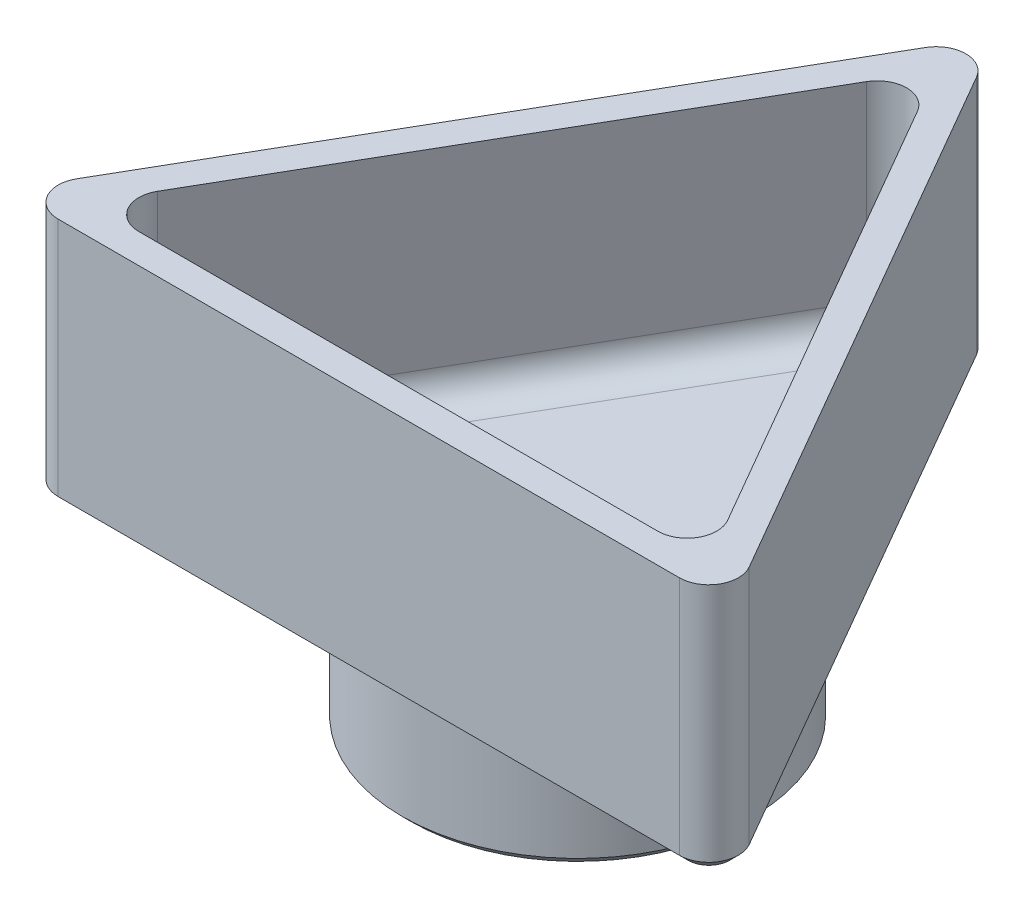
ISO-10303-21;
HEADER;
FILE_DESCRIPTION(('STEP AP214'),'2;1');
FILE_NAME('part.step','',(''),(''),'','','');
FILE_SCHEMA(('AUTOMOTIVE_DESIGN { 1 0 10303 214 1 1 1 1 }'));
ENDSEC;
DATA;
#1=APPLICATION_CONTEXT('core data for automotive mechanical design processes');
#2=APPLICATION_PROTOCOL_DEFINITION('international standard','automotive_design',2000,#1);
#3=PRODUCT_CONTEXT('',#1,'mechanical');
#4=PRODUCT('Part','Part','',(#3));
#5=PRODUCT_RELATED_PRODUCT_CATEGORY('part','',(#4));
#6=PRODUCT_DEFINITION_FORMATION('','',#4);
#7=PRODUCT_DEFINITION_CONTEXT('part definition',#1,'design');
#8=PRODUCT_DEFINITION('design','',#6,#7);
#9=PRODUCT_DEFINITION_SHAPE('','',#8);
#10=(LENGTH_UNIT() NAMED_UNIT(*) SI_UNIT(.MILLI.,.METRE.));
#11=(NAMED_UNIT(*) PLANE_ANGLE_UNIT() SI_UNIT($,.RADIAN.));
#12=(NAMED_UNIT(*) SI_UNIT($,.STERADIAN.) SOLID_ANGLE_UNIT());
#13=UNCERTAINTY_MEASURE_WITH_UNIT(LENGTH_MEASURE(1.E-05),#10,'distance_accuracy_value','');
#14=(GEOMETRIC_REPRESENTATION_CONTEXT(3) GLOBAL_UNCERTAINTY_ASSIGNED_CONTEXT((#13)) GLOBAL_UNIT_ASSIGNED_CONTEXT((#10,
#11,#12)) REPRESENTATION_CONTEXT('',''));
#15=CARTESIAN_POINT('',(0.,0.,0.));
#16=DIRECTION('',(0.,0.,1.));
#17=DIRECTION('',(1.,0.,0.));
#18=AXIS2_PLACEMENT_3D('',#15,#16,#17);
#19=CARTESIAN_POINT('',(0.,21.42998,0.));
#20=DIRECTION('',(0.,-1.,0.));
#21=DIRECTION('',(0.,0.,-1.));
#22=AXIS2_PLACEMENT_3D('',#19,#20,#21);
#23=PLANE('',#22);
#24=DIRECTION('',(-0.5,0.,-0.866025403784439));
#25=VECTOR('',#24,1.);
#26=CARTESIAN_POINT('',(0.,21.42998,-35.91687));
#27=LINE('',#26,#25);
#28=CARTESIAN_POINT('',(28.9052173188107,21.42998,14.148435));
#29=VERTEX_POINT('',#28);
#30=CARTESIAN_POINT('',(2.19970452561247,21.42998,-32.10687));
#31=VERTEX_POINT('',#30);
#32=EDGE_CURVE('E176',#29,#31,#27,.T.);
#33=ORIENTED_EDGE('',*,*,#32,.T.);
#34=CARTESIAN_POINT('',(0.,21.42998,-30.83687));
#35=DIRECTION('',(0.,-1.,0.));
#36=DIRECTION('',(0.,0.,-1.));
#37=AXIS2_PLACEMENT_3D('',#34,#35,#36);
#38=CIRCLE('',#37,2.54);
#39=CARTESIAN_POINT('',(-2.19970452561248,21.42998,-32.10687));
#40=VERTEX_POINT('',#39);
#41=EDGE_CURVE('E170',#31,#40,#38,.F.);
#42=ORIENTED_EDGE('',*,*,#41,.T.);
#43=DIRECTION('',(-0.5,0.,0.866025403784439));
#44=VECTOR('',#43,1.);
#45=CARTESIAN_POINT('',(-31.1049218444232,21.42998,17.958435));
#46=LINE('',#45,#44);
#47=CARTESIAN_POINT('',(-28.9052173188107,21.42998,14.148435));
#48=VERTEX_POINT('',#47);
#49=EDGE_CURVE('E173',#40,#48,#46,.T.);
#50=ORIENTED_EDGE('',*,*,#49,.T.);
#51=CARTESIAN_POINT('',(-26.7055127931982,21.42998,15.418435));
#52=DIRECTION('',(0.,-1.,0.));
#53=DIRECTION('',(0.,0.,-1.));
#54=AXIS2_PLACEMENT_3D('',#51,#52,#53);
#55=CIRCLE('',#54,2.54);
#56=CARTESIAN_POINT('',(-26.7055127931982,21.42998,17.958435));
#57=VERTEX_POINT('',#56);
#58=EDGE_CURVE('E204',#48,#57,#55,.F.);
#59=ORIENTED_EDGE('',*,*,#58,.T.);
#60=DIRECTION('',(1.,0.,0.));
#61=VECTOR('',#60,1.);
#62=CARTESIAN_POINT('',(31.1049218444232,21.42998,17.958435));
#63=LINE('',#62,#61);
#64=CARTESIAN_POINT('',(26.7055127931982,21.42998,17.958435));
#65=VERTEX_POINT('',#64);
#66=EDGE_CURVE('E189',#57,#65,#63,.T.);
#67=ORIENTED_EDGE('',*,*,#66,.T.);
#68=CARTESIAN_POINT('',(26.7055127931982,21.42998,15.418435));
#69=DIRECTION('',(0.,-1.,0.));
#70=DIRECTION('',(0.,0.,-1.));
#71=AXIS2_PLACEMENT_3D('',#68,#69,#70);
#72=CIRCLE('',#71,2.54);
#73=EDGE_CURVE('E180',#65,#29,#72,.F.);
#74=ORIENTED_EDGE('',*,*,#73,.T.);
#75=EDGE_LOOP('',(#33,#42,#50,#59,#67,#74));
#76=FACE_BOUND('',#75,.T.);
#77=DIRECTION('',(-0.5,0.,0.866025403784439));
#78=VECTOR('',#77,1.);
#79=CARTESIAN_POINT('',(-13.3527563965991,21.42998,-7.7092175));
#80=LINE('',#79,#78);
#81=CARTESIAN_POINT('',(-2.19970452561247,21.42998,-27.02687));
#82=VERTEX_POINT('',#81);
#83=CARTESIAN_POINT('',(-24.5058082675858,21.42998,11.608435));
#84=VERTEX_POINT('',#83);
#85=EDGE_CURVE('E270',#82,#84,#80,.T.);
#86=ORIENTED_EDGE('',*,*,#85,.F.);
#87=CARTESIAN_POINT('',(0.,21.42998,-25.75687));
#88=DIRECTION('',(0.,-1.,0.));
#89=DIRECTION('',(0.,0.,-1.));
#90=AXIS2_PLACEMENT_3D('',#87,#88,#89);
#91=CIRCLE('',#90,2.54);
#92=CARTESIAN_POINT('',(2.19970452561248,21.42998,-27.02687));
#93=VERTEX_POINT('',#92);
#94=EDGE_CURVE('E226',#82,#93,#91,.T.);
#95=ORIENTED_EDGE('',*,*,#94,.T.);
#96=DIRECTION('',(-0.5,0.,-0.866025403784439));
#97=VECTOR('',#96,1.);
#98=CARTESIAN_POINT('',(13.3527563965991,21.42998,-7.7092175));
#99=LINE('',#98,#97);
#100=CARTESIAN_POINT('',(24.5058082675858,21.42998,11.608435));
#101=VERTEX_POINT('',#100);
#102=EDGE_CURVE('E190',#101,#93,#99,.T.);
#103=ORIENTED_EDGE('',*,*,#102,.F.);
#104=CARTESIAN_POINT('',(22.3061037419733,21.42998,12.878435));
#105=DIRECTION('',(0.,-1.,0.));
#106=DIRECTION('',(0.,0.,-1.));
#107=AXIS2_PLACEMENT_3D('',#104,#105,#106);
#108=CIRCLE('',#107,2.54);
#109=CARTESIAN_POINT('',(22.3061037419733,21.42998,15.418435));
#110=VERTEX_POINT('',#109);
#111=EDGE_CURVE('E228',#101,#110,#108,.T.);
#112=ORIENTED_EDGE('',*,*,#111,.T.);
#113=DIRECTION('',(1.,0.,0.));
#114=VECTOR('',#113,1.);
#115=CARTESIAN_POINT('',(0.,21.42998,15.418435));
#116=LINE('',#115,#114);
#117=CARTESIAN_POINT('',(-22.3061037419733,21.42998,15.418435));
#118=VERTEX_POINT('',#117);
#119=EDGE_CURVE('E461',#118,#110,#116,.T.);
#120=ORIENTED_EDGE('',*,*,#119,.F.);
#121=CARTESIAN_POINT('',(-22.3061037419733,21.42998,12.878435));
#122=DIRECTION('',(0.,-1.,0.));
#123=DIRECTION('',(0.,0.,-1.));
#124=AXIS2_PLACEMENT_3D('',#121,#122,#123);
#125=CIRCLE('',#124,2.54);
#126=EDGE_CURVE('E230',#118,#84,#125,.T.);
#127=ORIENTED_EDGE('',*,*,#126,.T.);
#128=EDGE_LOOP('',(#86,#95,#103,#112,#120,#127));
#129=FACE_BOUND('',#128,.T.);
#130=ADVANCED_FACE('F50',(#76,#129),#23,.F.);
#131=CARTESIAN_POINT('',(-31.1049218444232,21.42998,17.958435));
#132=DIRECTION('',(0.866025403784438,0.,0.5));
#133=DIRECTION('',(0.5,0.,-0.866025403784439));
#134=AXIS2_PLACEMENT_3D('',#131,#132,#133);
#135=PLANE('',#134);
#136=DIRECTION('',(0.,-1.,0.));
#137=VECTOR('',#136,1.);
#138=CARTESIAN_POINT('',(-2.19970452561247,21.42998,-32.10687));
#139=LINE('',#138,#137);
#140=CARTESIAN_POINT('',(-2.19970452561247,0.761999999999999,-32.10687));
#141=VERTEX_POINT('',#140);
#142=EDGE_CURVE('E185',#40,#141,#139,.T.);
#143=ORIENTED_EDGE('',*,*,#142,.T.);
#144=DIRECTION('',(-0.5,0.,0.866025403784439));
#145=VECTOR('',#144,1.);
#146=CARTESIAN_POINT('',(-28.9052173188107,0.761999999999999,14.148435));
#147=LINE('',#146,#145);
#148=CARTESIAN_POINT('',(-28.9052173188107,0.761999999999999,14.148435));
#149=VERTEX_POINT('',#148);
#150=EDGE_CURVE('E288',#141,#149,#147,.T.);
#151=ORIENTED_EDGE('',*,*,#150,.T.);
#152=DIRECTION('',(0.,-1.,0.));
#153=VECTOR('',#152,1.);
#154=CARTESIAN_POINT('',(-28.9052173188107,21.42998,14.148435));
#155=LINE('',#154,#153);
#156=EDGE_CURVE('E188',#149,#48,#155,.F.);
#157=ORIENTED_EDGE('',*,*,#156,.T.);
#158=ORIENTED_EDGE('',*,*,#49,.F.);
#159=EDGE_LOOP('',(#143,#151,#157,#158));
#160=FACE_BOUND('',#159,.T.);
#161=ADVANCED_FACE('F184',(#160),#135,.F.);
#162=CARTESIAN_POINT('',(31.1049218444232,21.42998,17.958435));
#163=DIRECTION('',(0.,0.,-1.));
#164=DIRECTION('',(-1.,0.,0.));
#165=AXIS2_PLACEMENT_3D('',#162,#163,#164);
#166=PLANE('',#165);
#167=DIRECTION('',(0.,-1.,0.));
#168=VECTOR('',#167,1.);
#169=CARTESIAN_POINT('',(-26.7055127931982,21.42998,17.958435));
#170=LINE('',#169,#168);
#171=CARTESIAN_POINT('',(-26.7055127931982,0.761999999999999,17.958435));
#172=VERTEX_POINT('',#171);
#173=EDGE_CURVE('E179',#57,#172,#170,.T.);
#174=ORIENTED_EDGE('',*,*,#173,.T.);
#175=DIRECTION('',(1.,0.,0.));
#176=VECTOR('',#175,1.);
#177=CARTESIAN_POINT('',(26.7055127931982,0.761999999999999,17.958435));
#178=LINE('',#177,#176);
#179=CARTESIAN_POINT('',(26.7055127931982,0.761999999999999,17.958435));
#180=VERTEX_POINT('',#179);
#181=EDGE_CURVE('E286',#172,#180,#178,.T.);
#182=ORIENTED_EDGE('',*,*,#181,.T.);
#183=DIRECTION('',(0.,-1.,0.));
#184=VECTOR('',#183,1.);
#185=CARTESIAN_POINT('',(26.7055127931982,21.42998,17.958435));
#186=LINE('',#185,#184);
#187=EDGE_CURVE('E209',#180,#65,#186,.F.);
#188=ORIENTED_EDGE('',*,*,#187,.T.);
#189=ORIENTED_EDGE('',*,*,#66,.F.);
#190=EDGE_LOOP('',(#174,#182,#188,#189));
#191=FACE_BOUND('',#190,.T.);
#192=ADVANCED_FACE('F329',(#191),#166,.F.);
#193=CARTESIAN_POINT('',(0.,21.42998,-35.91687));
#194=DIRECTION('',(-0.866025403784438,0.,0.5));
#195=DIRECTION('',(0.5,0.,0.866025403784439));
#196=AXIS2_PLACEMENT_3D('',#193,#194,#195);
#197=PLANE('',#196);
#198=DIRECTION('',(0.,-1.,0.));
#199=VECTOR('',#198,1.);
#200=CARTESIAN_POINT('',(28.9052173188107,21.42998,14.148435));
#201=LINE('',#200,#199);
#202=CARTESIAN_POINT('',(28.9052173188107,0.761999999999999,14.148435));
#203=VERTEX_POINT('',#202);
#204=EDGE_CURVE('E195',#29,#203,#201,.T.);
#205=ORIENTED_EDGE('',*,*,#204,.T.);
#206=DIRECTION('',(-0.5,0.,-0.866025403784439));
#207=VECTOR('',#206,1.);
#208=CARTESIAN_POINT('',(2.19970452561247,0.761999999999999,-32.10687));
#209=LINE('',#208,#207);
#210=CARTESIAN_POINT('',(2.19970452561247,0.761999999999999,-32.10687));
#211=VERTEX_POINT('',#210);
#212=EDGE_CURVE('E66',#203,#211,#209,.T.);
#213=ORIENTED_EDGE('',*,*,#212,.T.);
#214=DIRECTION('',(0.,-1.,0.));
#215=VECTOR('',#214,1.);
#216=CARTESIAN_POINT('',(2.19970452561247,21.42998,-32.10687));
#217=LINE('',#216,#215);
#218=EDGE_CURVE('E197',#211,#31,#217,.F.);
#219=ORIENTED_EDGE('',*,*,#218,.T.);
#220=ORIENTED_EDGE('',*,*,#32,.F.);
#221=EDGE_LOOP('',(#205,#213,#219,#220));
#222=FACE_BOUND('',#221,.T.);
#223=ADVANCED_FACE('F339',(#222),#197,.F.);
#224=CARTESIAN_POINT('',(0.,0.,0.));
#225=DIRECTION('',(0.,-1.,0.));
#226=DIRECTION('',(0.,0.,-1.));
#227=AXIS2_PLACEMENT_3D('',#224,#225,#226);
#228=PLANE('',#227);
#229=DIRECTION('',(-1.,0.,0.));
#230=VECTOR('',#229,1.);
#231=CARTESIAN_POINT('',(-26.7055127931982,0.,17.196435));
#232=LINE('',#231,#230);
#233=CARTESIAN_POINT('',(26.7055127931982,0.,17.196435));
#234=VERTEX_POINT('',#233);
#235=CARTESIAN_POINT('',(-26.7055127931982,0.,17.196435));
#236=VERTEX_POINT('',#235);
#237=EDGE_CURVE('E278',#234,#236,#232,.T.);
#238=ORIENTED_EDGE('',*,*,#237,.T.);
#239=CARTESIAN_POINT('',(-26.7055127931982,0.,15.418435));
#240=DIRECTION('',(0.,-1.,0.));
#241=DIRECTION('',(0.,0.,-1.));
#242=AXIS2_PLACEMENT_3D('',#239,#240,#241);
#243=CIRCLE('',#242,1.778);
#244=CARTESIAN_POINT('',(-28.245305961127,0.,14.529435));
#245=VERTEX_POINT('',#244);
#246=EDGE_CURVE('E280',#236,#245,#243,.T.);
#247=ORIENTED_EDGE('',*,*,#246,.T.);
#248=DIRECTION('',(0.5,0.,-0.866025403784439));
#249=VECTOR('',#248,1.);
#250=CARTESIAN_POINT('',(-1.53979316792873,0.,-31.72587));
#251=LINE('',#250,#249);
#252=CARTESIAN_POINT('',(-1.53979316792873,0.,-31.72587));
#253=VERTEX_POINT('',#252);
#254=EDGE_CURVE('E276',#245,#253,#251,.T.);
#255=ORIENTED_EDGE('',*,*,#254,.T.);
#256=CARTESIAN_POINT('',(0.,0.,-30.83687));
#257=DIRECTION('',(0.,-1.,0.));
#258=DIRECTION('',(0.,0.,-1.));
#259=AXIS2_PLACEMENT_3D('',#256,#257,#258);
#260=CIRCLE('',#259,1.778);
#261=CARTESIAN_POINT('',(1.53979316792874,0.,-31.72587));
#262=VERTEX_POINT('',#261);
#263=EDGE_CURVE('E272',#253,#262,#260,.T.);
#264=ORIENTED_EDGE('',*,*,#263,.T.);
#265=DIRECTION('',(0.5,0.,0.866025403784439));
#266=VECTOR('',#265,1.);
#267=CARTESIAN_POINT('',(28.245305961127,0.,14.529435));
#268=LINE('',#267,#266);
#269=CARTESIAN_POINT('',(28.245305961127,0.,14.529435));
#270=VERTEX_POINT('',#269);
#271=EDGE_CURVE('E252',#262,#270,#268,.T.);
#272=ORIENTED_EDGE('',*,*,#271,.T.);
#273=CARTESIAN_POINT('',(26.7055127931982,0.,15.418435));
#274=DIRECTION('',(0.,-1.,0.));
#275=DIRECTION('',(0.,0.,-1.));
#276=AXIS2_PLACEMENT_3D('',#273,#274,#275);
#277=CIRCLE('',#276,1.778);
#278=EDGE_CURVE('E274',#270,#234,#277,.T.);
#279=ORIENTED_EDGE('',*,*,#278,.T.);
#280=EDGE_LOOP('',(#238,#247,#255,#264,#272,#279));
#281=FACE_BOUND('',#280,.T.);
#282=CARTESIAN_POINT('',(0.,0.,0.));
#283=DIRECTION('',(0.,-1.,0.));
#284=DIRECTION('',(0.,0.,-1.));
#285=AXIS2_PLACEMENT_3D('',#282,#283,#284);
#286=CIRCLE('',#285,15.08125);
#287=CARTESIAN_POINT('',(0.,0.,15.08125));
#288=VERTEX_POINT('',#287);
#289=EDGE_CURVE('E199',#288,#288,#286,.T.);
#290=ORIENTED_EDGE('',*,*,#289,.F.);
#291=EDGE_LOOP('',(#290));
#292=FACE_BOUND('',#291,.T.);
#293=ADVANCED_FACE('F335',(#281,#292),#228,.T.);
#294=CARTESIAN_POINT('',(-28.9052173188107,21.42998,19.228435));
#295=DIRECTION('',(0.866025403784438,0.,0.5));
#296=DIRECTION('',(0.5,0.,-0.866025403784439));
#297=AXIS2_PLACEMENT_3D('',#294,#295,#296);
#298=PLANE('',#297);
#299=DIRECTION('',(0.,-1.,0.));
#300=VECTOR('',#299,1.);
#301=CARTESIAN_POINT('',(-24.5058082675858,2.54,11.608435));
#302=LINE('',#301,#300);
#303=CARTESIAN_POINT('',(-24.5058082675858,5.08,11.608435));
#304=VERTEX_POINT('',#303);
#305=EDGE_CURVE('E216',#84,#304,#302,.T.);
#306=ORIENTED_EDGE('',*,*,#305,.T.);
#307=DIRECTION('',(-0.5,0.,0.866025403784439));
#308=VECTOR('',#307,1.);
#309=CARTESIAN_POINT('',(-28.9052173188107,5.08,19.228435));
#310=LINE('',#309,#308);
#311=CARTESIAN_POINT('',(-2.19970452561247,5.08,-27.02687));
#312=VERTEX_POINT('',#311);
#313=EDGE_CURVE('E246',#304,#312,#310,.F.);
#314=ORIENTED_EDGE('',*,*,#313,.T.);
#315=DIRECTION('',(0.,-1.,0.));
#316=VECTOR('',#315,1.);
#317=CARTESIAN_POINT('',(-2.19970452561247,21.42998,-27.02687));
#318=LINE('',#317,#316);
#319=EDGE_CURVE('E219',#312,#82,#318,.F.);
#320=ORIENTED_EDGE('',*,*,#319,.T.);
#321=ORIENTED_EDGE('',*,*,#85,.T.);
#322=EDGE_LOOP('',(#306,#314,#320,#321));
#323=FACE_BOUND('',#322,.T.);
#324=ADVANCED_FACE('F338',(#323),#298,.T.);
#325=CARTESIAN_POINT('',(31.1049218444232,21.42998,15.418435));
#326=DIRECTION('',(0.,0.,-1.));
#327=DIRECTION('',(-1.,0.,0.));
#328=AXIS2_PLACEMENT_3D('',#325,#326,#327);
#329=PLANE('',#328);
#330=DIRECTION('',(0.,-1.,0.));
#331=VECTOR('',#330,1.);
#332=CARTESIAN_POINT('',(22.3061037419733,2.54,15.418435));
#333=LINE('',#332,#331);
#334=CARTESIAN_POINT('',(22.3061037419733,5.08,15.418435));
#335=VERTEX_POINT('',#334);
#336=EDGE_CURVE('E223',#110,#335,#333,.T.);
#337=ORIENTED_EDGE('',*,*,#336,.T.);
#338=DIRECTION('',(1.,0.,0.));
#339=VECTOR('',#338,1.);
#340=CARTESIAN_POINT('',(31.1049218444232,5.08,15.418435));
#341=LINE('',#340,#339);
#342=CARTESIAN_POINT('',(-22.3061037419733,5.08,15.418435));
#343=VERTEX_POINT('',#342);
#344=EDGE_CURVE('E242',#335,#343,#341,.F.);
#345=ORIENTED_EDGE('',*,*,#344,.T.);
#346=DIRECTION('',(0.,-1.,0.));
#347=VECTOR('',#346,1.);
#348=CARTESIAN_POINT('',(-22.3061037419733,21.42998,15.418435));
#349=LINE('',#348,#347);
#350=EDGE_CURVE('E221',#343,#118,#349,.F.);
#351=ORIENTED_EDGE('',*,*,#350,.T.);
#352=ORIENTED_EDGE('',*,*,#119,.T.);
#353=EDGE_LOOP('',(#337,#345,#351,#352));
#354=FACE_BOUND('',#353,.T.);
#355=ADVANCED_FACE('F488',(#354),#329,.T.);
#356=CARTESIAN_POINT('',(-2.19970452561247,21.42998,-34.64687));
#357=DIRECTION('',(-0.866025403784438,0.,0.5));
#358=DIRECTION('',(0.5,0.,0.866025403784439));
#359=AXIS2_PLACEMENT_3D('',#356,#357,#358);
#360=PLANE('',#359);
#361=DIRECTION('',(0.,-1.,0.));
#362=VECTOR('',#361,1.);
#363=CARTESIAN_POINT('',(2.19970452561248,2.54,-27.02687));
#364=LINE('',#363,#362);
#365=CARTESIAN_POINT('',(2.19970452561248,5.08,-27.02687));
#366=VERTEX_POINT('',#365);
#367=EDGE_CURVE('E213',#93,#366,#364,.T.);
#368=ORIENTED_EDGE('',*,*,#367,.T.);
#369=DIRECTION('',(-0.5,0.,-0.866025403784439));
#370=VECTOR('',#369,1.);
#371=CARTESIAN_POINT('',(-2.19970452561247,5.08,-34.64687));
#372=LINE('',#371,#370);
#373=CARTESIAN_POINT('',(24.5058082675858,5.08,11.608435));
#374=VERTEX_POINT('',#373);
#375=EDGE_CURVE('E250',#366,#374,#372,.F.);
#376=ORIENTED_EDGE('',*,*,#375,.T.);
#377=DIRECTION('',(0.,-1.,0.));
#378=VECTOR('',#377,1.);
#379=CARTESIAN_POINT('',(24.5058082675858,21.42998,11.608435));
#380=LINE('',#379,#378);
#381=EDGE_CURVE('E211',#374,#101,#380,.F.);
#382=ORIENTED_EDGE('',*,*,#381,.T.);
#383=ORIENTED_EDGE('',*,*,#102,.T.);
#384=EDGE_LOOP('',(#368,#376,#382,#383));
#385=FACE_BOUND('',#384,.T.);
#386=ADVANCED_FACE('F469',(#385),#360,.T.);
#387=CARTESIAN_POINT('',(0.,2.54,0.));
#388=DIRECTION('',(0.,-1.,0.));
#389=DIRECTION('',(0.,0.,-1.));
#390=AXIS2_PLACEMENT_3D('',#387,#388,#389);
#391=PLANE('',#390);
#392=DIRECTION('',(-0.5,0.,0.866025403784439));
#393=VECTOR('',#392,1.);
#394=CARTESIAN_POINT('',(-11.1530518709866,2.54,-6.4392175));
#395=LINE('',#394,#393);
#396=CARTESIAN_POINT('',(0.,2.54,-25.75687));
#397=VERTEX_POINT('',#396);
#398=CARTESIAN_POINT('',(-22.3061037419733,2.54,12.878435));
#399=VERTEX_POINT('',#398);
#400=EDGE_CURVE('E237',#397,#399,#395,.T.);
#401=ORIENTED_EDGE('',*,*,#400,.T.);
#402=DIRECTION('',(1.,0.,0.));
#403=VECTOR('',#402,1.);
#404=CARTESIAN_POINT('',(0.,2.54,12.878435));
#405=LINE('',#404,#403);
#406=CARTESIAN_POINT('',(22.3061037419733,2.54,12.878435));
#407=VERTEX_POINT('',#406);
#408=EDGE_CURVE('E239',#399,#407,#405,.T.);
#409=ORIENTED_EDGE('',*,*,#408,.T.);
#410=DIRECTION('',(-0.5,0.,-0.866025403784439));
#411=VECTOR('',#410,1.);
#412=CARTESIAN_POINT('',(11.1530518709866,2.54,-6.4392175));
#413=LINE('',#412,#411);
#414=EDGE_CURVE('E235',#407,#397,#413,.T.);
#415=ORIENTED_EDGE('',*,*,#414,.T.);
#416=EDGE_LOOP('',(#401,#409,#415));
#417=FACE_BOUND('',#416,.T.);
#418=ADVANCED_FACE('F333',(#417),#391,.F.);
#419=CARTESIAN_POINT('',(0.,-11.90498,0.));
#420=DIRECTION('',(0.,1.,0.));
#421=DIRECTION('',(0.,0.,1.));
#422=AXIS2_PLACEMENT_3D('',#419,#420,#421);
#423=CYLINDRICAL_SURFACE('',#422,15.08125);
#424=CARTESIAN_POINT('',(0.,-11.14298,0.));
#425=DIRECTION('',(0.,-1.,0.));
#426=DIRECTION('',(0.,0.,-1.));
#427=AXIS2_PLACEMENT_3D('',#424,#425,#426);
#428=CIRCLE('',#427,15.08125);
#429=CARTESIAN_POINT('',(0.,-11.14298,15.08125));
#430=VERTEX_POINT('',#429);
#431=EDGE_CURVE('E13',#430,#430,#428,.F.);
#432=CARTESIAN_POINT('',(0.,-11.14298,15.08125));
#433=CARTESIAN_POINT('',(0.,-11.0269072916667,15.08125));
#434=CARTESIAN_POINT('',(0.,-10.9108345833334,15.08125));
#435=CARTESIAN_POINT('',(0.,-10.6786891666667,15.08125));
#436=CARTESIAN_POINT('',(0.,-10.5626164583334,15.08125));
#437=CARTESIAN_POINT('',(0.,-10.3304710416667,15.08125));
#438=CARTESIAN_POINT('',(0.,-10.2143983333334,15.08125));
#439=CARTESIAN_POINT('',(0.,-9.98225291666669,15.08125));
#440=CARTESIAN_POINT('',(0.,-9.86618020833335,15.08125));
#441=CARTESIAN_POINT('',(0.,-9.63403479166669,15.08125));
#442=CARTESIAN_POINT('',(0.,-9.51796208333335,15.08125));
#443=CARTESIAN_POINT('',(0.,-9.28581666666669,15.08125));
#444=CARTESIAN_POINT('',(0.,-9.16974395833335,15.08125));
#445=CARTESIAN_POINT('',(0.,-8.93759854166669,15.08125));
#446=CARTESIAN_POINT('',(0.,-8.82152583333335,15.08125));
#447=CARTESIAN_POINT('',(0.,-8.58938041666669,15.08125));
#448=CARTESIAN_POINT('',(0.,-8.47330770833335,15.08125));
#449=CARTESIAN_POINT('',(0.,-8.24116229166668,15.08125));
#450=CARTESIAN_POINT('',(0.,-8.12508958333335,15.08125));
#451=CARTESIAN_POINT('',(0.,-7.89294416666668,15.08125));
#452=CARTESIAN_POINT('',(0.,-7.77687145833335,15.08125));
#453=CARTESIAN_POINT('',(0.,-7.54472604166668,15.08125));
#454=CARTESIAN_POINT('',(0.,-7.42865333333335,15.08125));
#455=CARTESIAN_POINT('',(0.,-7.19650791666668,15.08125));
#456=CARTESIAN_POINT('',(0.,-7.08043520833335,15.08125));
#457=CARTESIAN_POINT('',(0.,-6.84828979166668,15.08125));
#458=CARTESIAN_POINT('',(0.,-6.73221708333335,15.08125));
#459=CARTESIAN_POINT('',(0.,-6.50007166666668,15.08125));
#460=CARTESIAN_POINT('',(0.,-6.38399895833335,15.08125));
#461=CARTESIAN_POINT('',(0.,-6.15185354166668,15.08125));
#462=CARTESIAN_POINT('',(0.,-6.03578083333335,15.08125));
#463=CARTESIAN_POINT('',(0.,-5.80363541666668,15.08125));
#464=CARTESIAN_POINT('',(0.,-5.68756270833335,15.08125));
#465=CARTESIAN_POINT('',(0.,-5.45541729166668,15.08125));
#466=CARTESIAN_POINT('',(0.,-5.33934458333335,15.08125));
#467=CARTESIAN_POINT('',(0.,-5.10719916666668,15.08125));
#468=CARTESIAN_POINT('',(0.,-4.99112645833335,15.08125));
#469=CARTESIAN_POINT('',(0.,-4.75898104166668,15.08125));
#470=CARTESIAN_POINT('',(0.,-4.64290833333334,15.08125));
#471=CARTESIAN_POINT('',(0.,-4.41076291666668,15.08125));
#472=CARTESIAN_POINT('',(0.,-4.29469020833334,15.08125));
#473=CARTESIAN_POINT('',(0.,-4.06254479166668,15.08125));
#474=CARTESIAN_POINT('',(0.,-3.94647208333334,15.08125));
#475=CARTESIAN_POINT('',(0.,-3.71432666666667,15.08125));
#476=CARTESIAN_POINT('',(0.,-3.59825395833334,15.08125));
#477=CARTESIAN_POINT('',(0.,-3.36610854166667,15.08125));
#478=CARTESIAN_POINT('',(0.,-3.25003583333334,15.08125));
#479=CARTESIAN_POINT('',(0.,-3.01789041666667,15.08125));
#480=CARTESIAN_POINT('',(0.,-2.90181770833334,15.08125));
#481=CARTESIAN_POINT('',(0.,-2.66967229166667,15.08125));
#482=CARTESIAN_POINT('',(0.,-2.55359958333334,15.08125));
#483=CARTESIAN_POINT('',(0.,-2.32145416666667,15.08125));
#484=CARTESIAN_POINT('',(0.,-2.20538145833334,15.08125));
#485=CARTESIAN_POINT('',(0.,-1.97323604166667,15.08125));
#486=CARTESIAN_POINT('',(0.,-1.85716333333334,15.08125));
#487=CARTESIAN_POINT('',(0.,-1.62501791666667,15.08125));
#488=CARTESIAN_POINT('',(0.,-1.50894520833334,15.08125));
#489=CARTESIAN_POINT('',(0.,-1.27679979166667,15.08125));
#490=CARTESIAN_POINT('',(0.,-1.16072708333333,15.08125));
#491=CARTESIAN_POINT('',(0.,-0.928581666666667,15.08125));
#492=CARTESIAN_POINT('',(0.,-0.812508958333333,15.08125));
#493=CARTESIAN_POINT('',(0.,-0.580363541666666,15.08125));
#494=CARTESIAN_POINT('',(0.,-0.464290833333333,15.08125));
#495=CARTESIAN_POINT('',(0.,-0.232145416666665,15.08125));
#496=CARTESIAN_POINT('',(0.,-0.116072708333332,15.08125));
#497=CARTESIAN_POINT('',(0.,0.,15.08125));
#498=B_SPLINE_CURVE_WITH_KNOTS('',3,(#432,#433,#434,#435,#436,#437,#438,#439,#440,#441,#442,
#443,#444,#445,#446,#447,#448,#449,#450,#451,#452,#453,#454,#455,#456,#457,#458,#459,#460,#461,
#462,#463,#464,#465,#466,#467,#468,#469,#470,#471,#472,#473,#474,#475,#476,#477,#478,#479,#480,
#481,#482,#483,#484,#485,#486,#487,#488,#489,#490,#491,#492,#493,#494,#495,#496,#497),
.UNSPECIFIED.,.F.,.F.,(4,2,2,2,2,2,2,2,2,2,2,2,2,2,2,2,2,2,2,2,2,2,2,2,2,2,2,2,2,2,2,2,4),(0.,
0.348218125000001,0.696436250000003,1.044654375,1.3928725,1.74109062500001,2.08930875000001,
2.43752687500001,2.78574500000001,3.13396312500001,3.48218125000001,3.83039937500001,
4.17861750000001,4.52683562500001,4.87505375000001,5.22327187500001,5.57149000000001,
5.91970812500001,6.26792625000002,6.61614437500002,6.96436250000002,7.31258062500002,
7.66079875000002,8.00901687500002,8.35723500000002,8.70545312500002,9.05367125000002,
9.40188937500002,9.75010750000003,10.098325625,10.44654375,10.794761875,11.14298),.UNSPECIFIED.);
#499=EDGE_CURVE('BSEAM505',#430,#288,#498,.T.);
#500=ORIENTED_EDGE('',*,*,#431,.T.);
#501=ORIENTED_EDGE('',*,*,#289,.T.);
#502=ORIENTED_EDGE('',*,*,#499,.T.);
#503=ORIENTED_EDGE('',*,*,#499,.F.);
#504=EDGE_LOOP('',(#500,#502,#501,#503));
#505=FACE_BOUND('',#504,.T.);
#506=ADVANCED_FACE('F505',(#505),#423,.T.);
#507=CARTESIAN_POINT('',(0.,-11.90498,0.));
#508=DIRECTION('',(0.,-1.,0.));
#509=DIRECTION('',(0.,0.,-1.));
#510=AXIS2_PLACEMENT_3D('',#507,#508,#509);
#511=PLANE('',#510);
#512=CARTESIAN_POINT('',(0.,-11.90498,0.));
#513=DIRECTION('',(0.,-1.,0.));
#514=DIRECTION('',(0.,0.,-1.));
#515=AXIS2_PLACEMENT_3D('',#512,#513,#514);
#516=CIRCLE('',#515,14.31925);
#517=CARTESIAN_POINT('',(0.,-11.90498,-14.31925));
#518=VERTEX_POINT('',#517);
#519=EDGE_CURVE('E59',#518,#518,#516,.T.);
#520=ORIENTED_EDGE('',*,*,#519,.T.);
#521=EDGE_LOOP('',(#520));
#522=FACE_BOUND('',#521,.T.);
#523=CARTESIAN_POINT('',(0.,-11.90498,0.));
#524=DIRECTION('',(0.,-1.,0.));
#525=DIRECTION('',(0.,0.,-1.));
#526=AXIS2_PLACEMENT_3D('',#523,#524,#525);
#527=CIRCLE('',#526,12.54125);
#528=CARTESIAN_POINT('',(0.,-11.90498,-12.54125));
#529=VERTEX_POINT('',#528);
#530=EDGE_CURVE('E531',#529,#529,#527,.T.);
#531=ORIENTED_EDGE('',*,*,#530,.F.);
#532=EDGE_LOOP('',(#531));
#533=FACE_BOUND('',#532,.T.);
#534=ADVANCED_FACE('F311',(#522,#533),#511,.T.);
#535=CARTESIAN_POINT('',(0.,21.42998,-30.83687));
#536=DIRECTION('',(0.,-1.,0.));
#537=DIRECTION('',(0.,0.,-1.));
#538=AXIS2_PLACEMENT_3D('',#535,#536,#537);
#539=CYLINDRICAL_SURFACE('',#538,2.54);
#540=ORIENTED_EDGE('',*,*,#218,.F.);
#541=CARTESIAN_POINT('',(0.,0.761999999999999,-30.83687));
#542=DIRECTION('',(0.,-1.,0.));
#543=DIRECTION('',(0.,0.,-1.));
#544=AXIS2_PLACEMENT_3D('',#541,#542,#543);
#545=CIRCLE('',#544,2.54);
#546=EDGE_CURVE('E194',#211,#141,#545,.F.);
#547=ORIENTED_EDGE('',*,*,#546,.T.);
#548=ORIENTED_EDGE('',*,*,#142,.F.);
#549=ORIENTED_EDGE('',*,*,#41,.F.);
#550=EDGE_LOOP('',(#540,#547,#548,#549));
#551=FACE_BOUND('',#550,.T.);
#552=ADVANCED_FACE('F192',(#551),#539,.T.);
#553=CARTESIAN_POINT('',(26.7055127931982,21.42998,15.418435));
#554=DIRECTION('',(0.,-1.,0.));
#555=DIRECTION('',(0.,0.,-1.));
#556=AXIS2_PLACEMENT_3D('',#553,#554,#555);
#557=CYLINDRICAL_SURFACE('',#556,2.54);
#558=ORIENTED_EDGE('',*,*,#187,.F.);
#559=CARTESIAN_POINT('',(26.7055127931982,0.761999999999999,15.418435));
#560=DIRECTION('',(0.,-1.,0.));
#561=DIRECTION('',(0.,0.,-1.));
#562=AXIS2_PLACEMENT_3D('',#559,#560,#561);
#563=CIRCLE('',#562,2.54);
#564=EDGE_CURVE('E74',#180,#203,#563,.F.);
#565=ORIENTED_EDGE('',*,*,#564,.T.);
#566=ORIENTED_EDGE('',*,*,#204,.F.);
#567=ORIENTED_EDGE('',*,*,#73,.F.);
#568=EDGE_LOOP('',(#558,#565,#566,#567));
#569=FACE_BOUND('',#568,.T.);
#570=ADVANCED_FACE('F348',(#569),#557,.T.);
#571=CARTESIAN_POINT('',(-26.7055127931982,21.42998,15.418435));
#572=DIRECTION('',(0.,-1.,0.));
#573=DIRECTION('',(0.,0.,-1.));
#574=AXIS2_PLACEMENT_3D('',#571,#572,#573);
#575=CYLINDRICAL_SURFACE('',#574,2.54);
#576=ORIENTED_EDGE('',*,*,#156,.F.);
#577=CARTESIAN_POINT('',(-26.7055127931982,0.761999999999999,15.418435));
#578=DIRECTION('',(0.,-1.,0.));
#579=DIRECTION('',(0.,0.,-1.));
#580=AXIS2_PLACEMENT_3D('',#577,#578,#579);
#581=CIRCLE('',#580,2.54);
#582=EDGE_CURVE('E283',#149,#172,#581,.F.);
#583=ORIENTED_EDGE('',*,*,#582,.T.);
#584=ORIENTED_EDGE('',*,*,#173,.F.);
#585=ORIENTED_EDGE('',*,*,#58,.F.);
#586=EDGE_LOOP('',(#576,#583,#584,#585));
#587=FACE_BOUND('',#586,.T.);
#588=ADVANCED_FACE('F351',(#587),#575,.T.);
#589=CARTESIAN_POINT('',(0.,21.42998,-25.75687));
#590=DIRECTION('',(0.,1.,0.));
#591=DIRECTION('',(0.,0.,1.));
#592=AXIS2_PLACEMENT_3D('',#589,#590,#591);
#593=CYLINDRICAL_SURFACE('',#592,2.54);
#594=ORIENTED_EDGE('',*,*,#319,.F.);
#595=CARTESIAN_POINT('',(0.,5.08,-25.75687));
#596=DIRECTION('',(0.,1.,0.));
#597=DIRECTION('',(0.,0.,1.));
#598=AXIS2_PLACEMENT_3D('',#595,#596,#597);
#599=CIRCLE('',#598,2.54);
#600=EDGE_CURVE('E248',#312,#366,#599,.F.);
#601=ORIENTED_EDGE('',*,*,#600,.T.);
#602=ORIENTED_EDGE('',*,*,#367,.F.);
#603=ORIENTED_EDGE('',*,*,#94,.F.);
#604=EDGE_LOOP('',(#594,#601,#602,#603));
#605=FACE_BOUND('',#604,.T.);
#606=ADVANCED_FACE('F354',(#605),#593,.F.);
#607=CARTESIAN_POINT('',(22.3061037419733,21.42998,12.878435));
#608=DIRECTION('',(0.,1.,0.));
#609=DIRECTION('',(0.,0.,1.));
#610=AXIS2_PLACEMENT_3D('',#607,#608,#609);
#611=CYLINDRICAL_SURFACE('',#610,2.54);
#612=ORIENTED_EDGE('',*,*,#381,.F.);
#613=CARTESIAN_POINT('',(22.3061037419733,5.08,12.878435));
#614=DIRECTION('',(0.,1.,0.));
#615=DIRECTION('',(0.,0.,1.));
#616=AXIS2_PLACEMENT_3D('',#613,#614,#615);
#617=CIRCLE('',#616,2.54);
#618=EDGE_CURVE('E232',#374,#335,#617,.F.);
#619=ORIENTED_EDGE('',*,*,#618,.T.);
#620=ORIENTED_EDGE('',*,*,#336,.F.);
#621=ORIENTED_EDGE('',*,*,#111,.F.);
#622=EDGE_LOOP('',(#612,#619,#620,#621));
#623=FACE_BOUND('',#622,.T.);
#624=ADVANCED_FACE('F358',(#623),#611,.F.);
#625=CARTESIAN_POINT('',(-22.3061037419733,21.42998,12.878435));
#626=DIRECTION('',(0.,1.,0.));
#627=DIRECTION('',(0.,0.,1.));
#628=AXIS2_PLACEMENT_3D('',#625,#626,#627);
#629=CYLINDRICAL_SURFACE('',#628,2.54);
#630=ORIENTED_EDGE('',*,*,#350,.F.);
#631=CARTESIAN_POINT('',(-22.3061037419733,5.08,12.878435));
#632=DIRECTION('',(0.,1.,0.));
#633=DIRECTION('',(0.,0.,1.));
#634=AXIS2_PLACEMENT_3D('',#631,#632,#633);
#635=CIRCLE('',#634,2.54);
#636=EDGE_CURVE('E244',#343,#304,#635,.F.);
#637=ORIENTED_EDGE('',*,*,#636,.T.);
#638=ORIENTED_EDGE('',*,*,#305,.F.);
#639=ORIENTED_EDGE('',*,*,#126,.F.);
#640=EDGE_LOOP('',(#630,#637,#638,#639));
#641=FACE_BOUND('',#640,.T.);
#642=ADVANCED_FACE('F362',(#641),#629,.F.);
#643=CARTESIAN_POINT('',(-11.1530518709866,5.08,-6.4392175));
#644=DIRECTION('',(-0.5,0.,0.866025403784439));
#645=DIRECTION('',(0.866025403784439,0.,0.5));
#646=AXIS2_PLACEMENT_3D('',#643,#644,#645);
#647=CYLINDRICAL_SURFACE('',#646,2.54);
#648=CARTESIAN_POINT('',(0.,5.08,-25.75687));
#649=DIRECTION('',(-0.5,0.,0.866025403784439));
#650=DIRECTION('',(0.866025403784439,0.,0.5));
#651=AXIS2_PLACEMENT_3D('',#648,#649,#650);
#652=CIRCLE('',#651,2.54);
#653=EDGE_CURVE('E264',#312,#397,#652,.T.);
#654=ORIENTED_EDGE('',*,*,#653,.F.);
#655=ORIENTED_EDGE('',*,*,#313,.F.);
#656=CARTESIAN_POINT('',(-22.3061037419733,5.08,12.878435));
#657=DIRECTION('',(0.5,0.,-0.866025403784439));
#658=DIRECTION('',(-0.866025403784439,0.,-0.5));
#659=AXIS2_PLACEMENT_3D('',#656,#657,#658);
#660=CIRCLE('',#659,2.54);
#661=EDGE_CURVE('E267',#399,#304,#660,.T.);
#662=ORIENTED_EDGE('',*,*,#661,.F.);
#663=ORIENTED_EDGE('',*,*,#400,.F.);
#664=EDGE_LOOP('',(#654,#655,#662,#663));
#665=FACE_BOUND('',#664,.T.);
#666=ADVANCED_FACE('F366',(#665),#647,.F.);
#667=CARTESIAN_POINT('',(-22.3061037419733,5.08,12.878435));
#668=DIRECTION('',(0.,-1.,0.));
#669=DIRECTION('',(0.,0.,-1.));
#670=AXIS2_PLACEMENT_3D('',#667,#668,#669);
#671=SPHERICAL_SURFACE('',#670,2.54);
#672=ORIENTED_EDGE('',*,*,#661,.T.);
#673=ORIENTED_EDGE('',*,*,#636,.F.);
#674=CARTESIAN_POINT('',(-22.3061037419733,5.08,12.878435));
#675=DIRECTION('',(-1.,0.,0.));
#676=DIRECTION('',(0.,0.,1.));
#677=AXIS2_PLACEMENT_3D('',#674,#675,#676);
#678=CIRCLE('',#677,2.54);
#679=EDGE_CURVE('E261',#399,#343,#678,.T.);
#680=ORIENTED_EDGE('',*,*,#679,.F.);
#681=EDGE_LOOP('',(#672,#673,#680));
#682=FACE_BOUND('',#681,.T.);
#683=ADVANCED_FACE('F384',(#682),#671,.F.);
#684=CARTESIAN_POINT('',(0.,5.08,-25.75687));
#685=DIRECTION('',(0.,-1.,0.));
#686=DIRECTION('',(0.,0.,-1.));
#687=AXIS2_PLACEMENT_3D('',#684,#685,#686);
#688=SPHERICAL_SURFACE('',#687,2.54);
#689=ORIENTED_EDGE('',*,*,#600,.F.);
#690=ORIENTED_EDGE('',*,*,#653,.T.);
#691=CARTESIAN_POINT('',(0.,5.08,-25.75687));
#692=DIRECTION('',(-0.5,0.,-0.866025403784439));
#693=DIRECTION('',(-0.866025403784439,0.,0.5));
#694=AXIS2_PLACEMENT_3D('',#691,#692,#693);
#695=CIRCLE('',#694,2.54);
#696=EDGE_CURVE('E258',#366,#397,#695,.T.);
#697=ORIENTED_EDGE('',*,*,#696,.F.);
#698=EDGE_LOOP('',(#689,#690,#697));
#699=FACE_BOUND('',#698,.T.);
#700=ADVANCED_FACE('F380',(#699),#688,.F.);
#701=CARTESIAN_POINT('',(0.,5.08,12.878435));
#702=DIRECTION('',(1.,0.,0.));
#703=DIRECTION('',(0.,0.,-1.));
#704=AXIS2_PLACEMENT_3D('',#701,#702,#703);
#705=CYLINDRICAL_SURFACE('',#704,2.54);
#706=ORIENTED_EDGE('',*,*,#679,.T.);
#707=ORIENTED_EDGE('',*,*,#344,.F.);
#708=CARTESIAN_POINT('',(22.3061037419733,5.08,12.878435));
#709=DIRECTION('',(-1.,0.,0.));
#710=DIRECTION('',(0.,0.,1.));
#711=AXIS2_PLACEMENT_3D('',#708,#709,#710);
#712=CIRCLE('',#711,2.54);
#713=EDGE_CURVE('E255',#407,#335,#712,.T.);
#714=ORIENTED_EDGE('',*,*,#713,.F.);
#715=ORIENTED_EDGE('',*,*,#408,.F.);
#716=EDGE_LOOP('',(#706,#707,#714,#715));
#717=FACE_BOUND('',#716,.T.);
#718=ADVANCED_FACE('F376',(#717),#705,.F.);
#719=CARTESIAN_POINT('',(11.1530518709866,5.08,-6.4392175));
#720=DIRECTION('',(-0.5,0.,-0.866025403784439));
#721=DIRECTION('',(-0.866025403784439,0.,0.5));
#722=AXIS2_PLACEMENT_3D('',#719,#720,#721);
#723=CYLINDRICAL_SURFACE('',#722,2.54);
#724=ORIENTED_EDGE('',*,*,#696,.T.);
#725=ORIENTED_EDGE('',*,*,#414,.F.);
#726=CARTESIAN_POINT('',(22.3061037419733,5.08,12.878435));
#727=DIRECTION('',(-0.5,0.,-0.866025403784439));
#728=DIRECTION('',(-0.866025403784439,0.,0.5));
#729=AXIS2_PLACEMENT_3D('',#726,#727,#728);
#730=CIRCLE('',#729,2.54);
#731=EDGE_CURVE('E253',#374,#407,#730,.T.);
#732=ORIENTED_EDGE('',*,*,#731,.F.);
#733=ORIENTED_EDGE('',*,*,#375,.F.);
#734=EDGE_LOOP('',(#724,#725,#732,#733));
#735=FACE_BOUND('',#734,.T.);
#736=ADVANCED_FACE('F372',(#735),#723,.F.);
#737=CARTESIAN_POINT('',(22.3061037419733,5.08,12.878435));
#738=DIRECTION('',(0.,-1.,0.));
#739=DIRECTION('',(0.,0.,-1.));
#740=AXIS2_PLACEMENT_3D('',#737,#738,#739);
#741=SPHERICAL_SURFACE('',#740,2.54);
#742=ORIENTED_EDGE('',*,*,#713,.T.);
#743=ORIENTED_EDGE('',*,*,#618,.F.);
#744=ORIENTED_EDGE('',*,*,#731,.T.);
#745=EDGE_LOOP('',(#742,#743,#744));
#746=FACE_BOUND('',#745,.T.);
#747=ADVANCED_FACE('F368',(#746),#741,.F.);
#748=CARTESIAN_POINT('',(0.,0.761999999999999,-35.91687));
#749=DIRECTION('',(0.612372435695794,-0.707106781186548,-0.353553390593273));
#750=DIRECTION('',(0.5,0.,0.866025403784439));
#751=AXIS2_PLACEMENT_3D('',#748,#749,#750);
#752=PLANE('',#751);
#753=DIRECTION('',(-0.612372435695794,-0.707106781186548,0.353553390593274));
#754=VECTOR('',#753,1.);
#755=CARTESIAN_POINT('',(2.19970452561248,0.761999999999999,-32.10687));
#756=LINE('',#755,#754);
#757=EDGE_CURVE('E304',#211,#262,#756,.T.);
#758=ORIENTED_EDGE('',*,*,#757,.F.);
#759=ORIENTED_EDGE('',*,*,#212,.F.);
#760=DIRECTION('',(0.612372435695795,0.707106781186547,-0.353553390593273));
#761=VECTOR('',#760,1.);
#762=CARTESIAN_POINT('',(28.245305961127,0.,14.529435));
#763=LINE('',#762,#761);
#764=EDGE_CURVE('E256',#270,#203,#763,.T.);
#765=ORIENTED_EDGE('',*,*,#764,.F.);
#766=ORIENTED_EDGE('',*,*,#271,.F.);
#767=EDGE_LOOP('',(#758,#759,#765,#766));
#768=FACE_BOUND('',#767,.T.);
#769=ADVANCED_FACE('F371',(#768),#752,.T.);
#770=CARTESIAN_POINT('',(26.7055127931982,0.,15.418435));
#771=DIRECTION('',(0.,1.,0.));
#772=DIRECTION('',(0.,0.,1.));
#773=AXIS2_PLACEMENT_3D('',#770,#771,#772);
#774=CONICAL_SURFACE('',#773,1.778,0.78539816339745);
#775=ORIENTED_EDGE('',*,*,#764,.T.);
#776=ORIENTED_EDGE('',*,*,#564,.F.);
#777=DIRECTION('',(0.,0.707106781186546,0.707106781186549));
#778=VECTOR('',#777,1.);
#779=CARTESIAN_POINT('',(26.7055127931982,0.,17.196435));
#780=LINE('',#779,#778);
#781=EDGE_CURVE('E301',#234,#180,#780,.T.);
#782=ORIENTED_EDGE('',*,*,#781,.F.);
#783=ORIENTED_EDGE('',*,*,#278,.F.);
#784=EDGE_LOOP('',(#775,#776,#782,#783));
#785=FACE_BOUND('',#784,.T.);
#786=ADVANCED_FACE('F420',(#785),#774,.T.);
#787=CARTESIAN_POINT('',(0.,0.,-30.83687));
#788=DIRECTION('',(0.,1.,0.));
#789=DIRECTION('',(0.,0.,1.));
#790=AXIS2_PLACEMENT_3D('',#787,#788,#789);
#791=CONICAL_SURFACE('',#790,1.778,0.785398163397449);
#792=ORIENTED_EDGE('',*,*,#757,.T.);
#793=ORIENTED_EDGE('',*,*,#263,.F.);
#794=DIRECTION('',(0.612372435695795,-0.707106781186547,0.353553390593273));
#795=VECTOR('',#794,1.);
#796=CARTESIAN_POINT('',(-2.19970452561247,0.761999999999999,-32.10687));
#797=LINE('',#796,#795);
#798=EDGE_CURVE('E298',#141,#253,#797,.T.);
#799=ORIENTED_EDGE('',*,*,#798,.F.);
#800=ORIENTED_EDGE('',*,*,#546,.F.);
#801=EDGE_LOOP('',(#792,#793,#799,#800));
#802=FACE_BOUND('',#801,.T.);
#803=ADVANCED_FACE('F413',(#802),#791,.T.);
#804=CARTESIAN_POINT('',(31.1049218444232,0.761999999999999,17.958435));
#805=DIRECTION('',(0.,-0.707106781186548,0.707106781186548));
#806=DIRECTION('',(-1.,0.,0.));
#807=AXIS2_PLACEMENT_3D('',#804,#805,#806);
#808=PLANE('',#807);
#809=ORIENTED_EDGE('',*,*,#781,.T.);
#810=ORIENTED_EDGE('',*,*,#181,.F.);
#811=DIRECTION('',(0.,0.707106781186548,0.707106781186548));
#812=VECTOR('',#811,1.);
#813=CARTESIAN_POINT('',(-26.7055127931982,0.,17.196435));
#814=LINE('',#813,#812);
#815=EDGE_CURVE('E295',#236,#172,#814,.T.);
#816=ORIENTED_EDGE('',*,*,#815,.F.);
#817=ORIENTED_EDGE('',*,*,#237,.F.);
#818=EDGE_LOOP('',(#809,#810,#816,#817));
#819=FACE_BOUND('',#818,.T.);
#820=ADVANCED_FACE('F406',(#819),#808,.T.);
#821=CARTESIAN_POINT('',(-31.1049218444232,0.761999999999999,17.958435));
#822=DIRECTION('',(-0.612372435695793,-0.707106781186549,-0.353553390593273));
#823=DIRECTION('',(0.5,0.,-0.866025403784439));
#824=AXIS2_PLACEMENT_3D('',#821,#822,#823);
#825=PLANE('',#824);
#826=ORIENTED_EDGE('',*,*,#798,.T.);
#827=ORIENTED_EDGE('',*,*,#254,.F.);
#828=DIRECTION('',(0.612372435695796,-0.707106781186547,0.353553390593274));
#829=VECTOR('',#828,1.);
#830=CARTESIAN_POINT('',(-28.9052173188107,0.761999999999999,14.148435));
#831=LINE('',#830,#829);
#832=EDGE_CURVE('E293',#149,#245,#831,.T.);
#833=ORIENTED_EDGE('',*,*,#832,.F.);
#834=ORIENTED_EDGE('',*,*,#150,.F.);
#835=EDGE_LOOP('',(#826,#827,#833,#834));
#836=FACE_BOUND('',#835,.T.);
#837=ADVANCED_FACE('F399',(#836),#825,.T.);
#838=CARTESIAN_POINT('',(-26.7055127931982,0.,15.418435));
#839=DIRECTION('',(0.,1.,0.));
#840=DIRECTION('',(0.,0.,1.));
#841=AXIS2_PLACEMENT_3D('',#838,#839,#840);
#842=CONICAL_SURFACE('',#841,1.778,0.785398163397448);
#843=ORIENTED_EDGE('',*,*,#815,.T.);
#844=ORIENTED_EDGE('',*,*,#582,.F.);
#845=ORIENTED_EDGE('',*,*,#832,.T.);
#846=ORIENTED_EDGE('',*,*,#246,.F.);
#847=EDGE_LOOP('',(#843,#844,#845,#846));
#848=FACE_BOUND('',#847,.T.);
#849=ADVANCED_FACE('F393',(#848),#842,.T.);
#850=CARTESIAN_POINT('',(0.,35.4720116782232,0.));
#851=DIRECTION('',(0.,-1.,0.));
#852=DIRECTION('',(0.,0.,-1.));
#853=AXIS2_PLACEMENT_3D('',#850,#851,#852);
#854=CYLINDRICAL_SURFACE('',#853,12.54125);
#855=CARTESIAN_POINT('',(0.,0.,0.));
#856=DIRECTION('',(0.,-1.,0.));
#857=DIRECTION('',(0.,0.,-1.));
#858=AXIS2_PLACEMENT_3D('',#855,#856,#857);
#859=CIRCLE('',#858,12.54125);
#860=CARTESIAN_POINT('',(0.,0.,-12.54125));
#861=VERTEX_POINT('',#860);
#862=EDGE_CURVE('E296',#861,#861,#859,.F.);
#863=ORIENTED_EDGE('',*,*,#862,.T.);
#864=EDGE_LOOP('',(#863));
#865=FACE_BOUND('',#864,.T.);
#866=ORIENTED_EDGE('',*,*,#530,.T.);
#867=EDGE_LOOP('',(#866));
#868=FACE_BOUND('',#867,.T.);
#869=ADVANCED_FACE('F320',(#865,#868),#854,.F.);
#870=CARTESIAN_POINT('',(0.,0.,0.));
#871=DIRECTION('',(0.,-1.,0.));
#872=DIRECTION('',(0.,0.,-1.));
#873=AXIS2_PLACEMENT_3D('',#870,#871,#872);
#874=PLANE('',#873);
#875=ORIENTED_EDGE('',*,*,#862,.F.);
#876=EDGE_LOOP('',(#875));
#877=FACE_BOUND('',#876,.T.);
#878=ADVANCED_FACE('F315',(#877),#874,.T.);
#879=CARTESIAN_POINT('',(0.,-11.90498,0.));
#880=DIRECTION('',(0.,1.,0.));
#881=DIRECTION('',(0.,0.,1.));
#882=AXIS2_PLACEMENT_3D('',#879,#880,#881);
#883=CONICAL_SURFACE('',#882,14.31925,0.785398163397437);
#884=ORIENTED_EDGE('',*,*,#431,.F.);
#885=EDGE_LOOP('',(#884));
#886=FACE_BOUND('',#885,.T.);
#887=ORIENTED_EDGE('',*,*,#519,.F.);
#888=EDGE_LOOP('',(#887));
#889=FACE_BOUND('',#888,.T.);
#890=ADVANCED_FACE('F53',(#886,#889),#883,.T.);
#891=CLOSED_SHELL('',(#130,#161,#192,#223,#293,#324,#355,#386,#418,#506,#534,#552,#570,#588,
#606,#624,#642,#666,#683,#700,#718,#736,#747,#769,#786,#803,#820,#837,#849,#869,#878,#890));
#892=MANIFOLD_SOLID_BREP('B2',#891);
#893=ADVANCED_BREP_SHAPE_REPRESENTATION('',(#18,#892),#14);
#894=SHAPE_DEFINITION_REPRESENTATION(#9,#893);
ENDSEC;
END-ISO-10303-21;
